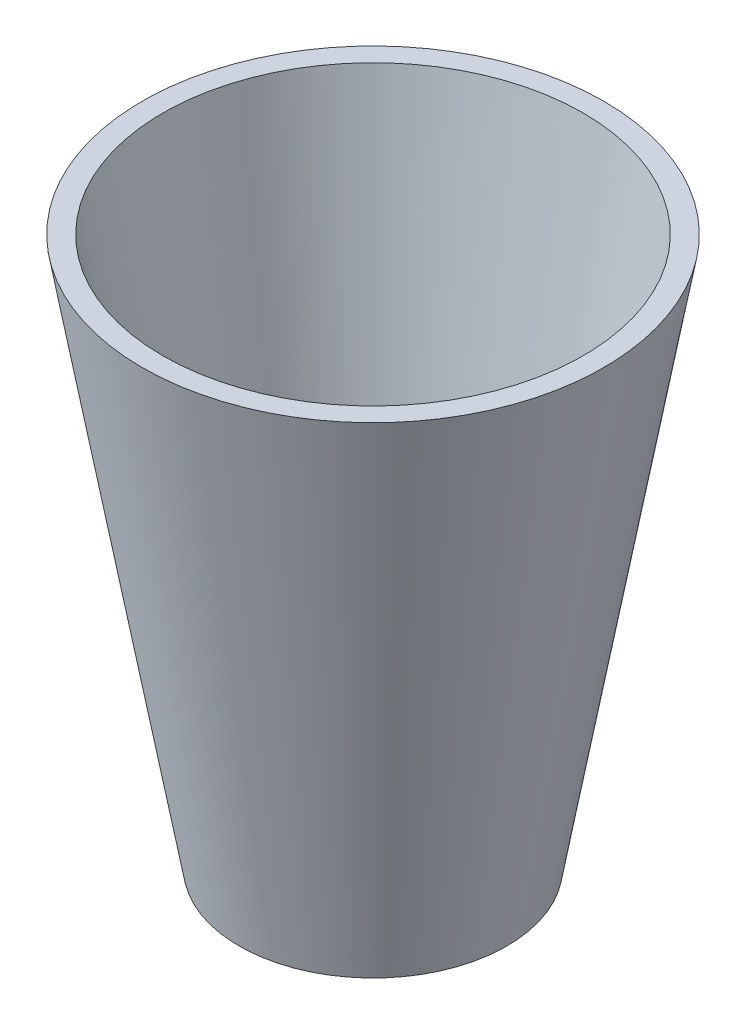
ISO-10303-21;
HEADER;
FILE_DESCRIPTION(('STEP AP214'),'2;1');
FILE_NAME('part.step','',(''),(''),'','','');
FILE_SCHEMA(('AUTOMOTIVE_DESIGN { 1 0 10303 214 1 1 1 1 }'));
ENDSEC;
DATA;
#1=APPLICATION_CONTEXT('core data for automotive mechanical design processes');
#2=APPLICATION_PROTOCOL_DEFINITION('international standard','automotive_design',2000,#1);
#3=PRODUCT_CONTEXT('',#1,'mechanical');
#4=PRODUCT('Part','Part','',(#3));
#5=PRODUCT_RELATED_PRODUCT_CATEGORY('part','',(#4));
#6=PRODUCT_DEFINITION_FORMATION('','',#4);
#7=PRODUCT_DEFINITION_CONTEXT('part definition',#1,'design');
#8=PRODUCT_DEFINITION('design','',#6,#7);
#9=PRODUCT_DEFINITION_SHAPE('','',#8);
#10=(LENGTH_UNIT() NAMED_UNIT(*) SI_UNIT(.MILLI.,.METRE.));
#11=(NAMED_UNIT(*) PLANE_ANGLE_UNIT() SI_UNIT($,.RADIAN.));
#12=(NAMED_UNIT(*) SI_UNIT($,.STERADIAN.) SOLID_ANGLE_UNIT());
#13=UNCERTAINTY_MEASURE_WITH_UNIT(LENGTH_MEASURE(1.E-05),#10,'distance_accuracy_value','');
#14=(GEOMETRIC_REPRESENTATION_CONTEXT(3) GLOBAL_UNCERTAINTY_ASSIGNED_CONTEXT((#13)) GLOBAL_UNIT_ASSIGNED_CONTEXT((#10,
#11,#12)) REPRESENTATION_CONTEXT('',''));
#15=CARTESIAN_POINT('',(0.,0.,0.));
#16=DIRECTION('',(0.,0.,1.));
#17=DIRECTION('',(1.,0.,0.));
#18=AXIS2_PLACEMENT_3D('',#15,#16,#17);
#19=CARTESIAN_POINT('',(0.,0.,0.));
#20=DIRECTION('',(0.,-1.,0.));
#21=DIRECTION('',(0.,0.,-1.));
#22=AXIS2_PLACEMENT_3D('',#19,#20,#21);
#23=PLANE('',#22);
#24=CARTESIAN_POINT('',(0.,0.,0.));
#25=DIRECTION('',(0.,-1.,0.));
#26=DIRECTION('',(0.,0.,-1.));
#27=AXIS2_PLACEMENT_3D('',#24,#25,#26);
#28=CIRCLE('',#27,22.875);
#29=CARTESIAN_POINT('',(0.,0.,-22.875));
#30=VERTEX_POINT('',#29);
#31=EDGE_CURVE('E10',#30,#30,#28,.T.);
#32=ORIENTED_EDGE('',*,*,#31,.T.);
#33=EDGE_LOOP('',(#32));
#34=FACE_BOUND('',#33,.T.);
#35=ADVANCED_FACE('F35',(#34),#23,.T.);
#36=CARTESIAN_POINT('',(0.,0.,0.));
#37=DIRECTION('',(0.,1.,0.));
#38=DIRECTION('',(0.,0.,1.));
#39=AXIS2_PLACEMENT_3D('',#36,#37,#38);
#40=CONICAL_SURFACE('',#39,22.875,0.174383300328485);
#41=CARTESIAN_POINT('',(0.,93.8,0.));
#42=DIRECTION('',(0.,-1.,0.));
#43=DIRECTION('',(0.,0.,-1.));
#44=AXIS2_PLACEMENT_3D('',#41,#42,#43);
#45=CIRCLE('',#44,39.4);
#46=CARTESIAN_POINT('',(0.,93.8,-39.4));
#47=VERTEX_POINT('',#46);
#48=EDGE_CURVE('E41',#47,#47,#45,.T.);
#49=ORIENTED_EDGE('',*,*,#48,.T.);
#50=EDGE_LOOP('',(#49));
#51=FACE_BOUND('',#50,.T.);
#52=ORIENTED_EDGE('',*,*,#31,.F.);
#53=EDGE_LOOP('',(#52));
#54=FACE_BOUND('',#53,.T.);
#55=ADVANCED_FACE('F67',(#51,#54),#40,.T.);
#56=CARTESIAN_POINT('',(0.,93.8,-39.4));
#57=DIRECTION('',(0.,1.,0.));
#58=DIRECTION('',(0.,0.,1.));
#59=AXIS2_PLACEMENT_3D('',#56,#57,#58);
#60=PLANE('',#59);
#61=CARTESIAN_POINT('',(0.,93.8,0.));
#62=DIRECTION('',(0.,-1.,0.));
#63=DIRECTION('',(0.,0.,-1.));
#64=AXIS2_PLACEMENT_3D('',#61,#62,#63);
#65=CIRCLE('',#64,35.8968705724999);
#66=CARTESIAN_POINT('',(0.,93.8,-35.8968705724999));
#67=VERTEX_POINT('',#66);
#68=EDGE_CURVE('E45',#67,#67,#65,.T.);
#69=ORIENTED_EDGE('',*,*,#68,.T.);
#70=EDGE_LOOP('',(#69));
#71=FACE_BOUND('',#70,.T.);
#72=ORIENTED_EDGE('',*,*,#48,.F.);
#73=EDGE_LOOP('',(#72));
#74=FACE_BOUND('',#73,.T.);
#75=ADVANCED_FACE('F64',(#71,#74),#60,.T.);
#76=CARTESIAN_POINT('',(0.,93.8,0.));
#77=DIRECTION('',(0.,1.,0.));
#78=DIRECTION('',(0.,0.,1.));
#79=AXIS2_PLACEMENT_3D('',#76,#77,#78);
#80=CONICAL_SURFACE('',#79,35.8968705724999,0.174383300328485);
#81=CARTESIAN_POINT('',(0.,3.45,0.));
#82=DIRECTION('',(0.,-1.,0.));
#83=DIRECTION('',(0.,0.,-1.));
#84=AXIS2_PLACEMENT_3D('',#81,#82,#83);
#85=CIRCLE('',#84,19.9796664147174);
#86=CARTESIAN_POINT('',(0.,3.45,-19.9796664147174));
#87=VERTEX_POINT('',#86);
#88=EDGE_CURVE('E49',#87,#87,#85,.T.);
#89=ORIENTED_EDGE('',*,*,#88,.T.);
#90=EDGE_LOOP('',(#89));
#91=FACE_BOUND('',#90,.T.);
#92=ORIENTED_EDGE('',*,*,#68,.F.);
#93=EDGE_LOOP('',(#92));
#94=FACE_BOUND('',#93,.T.);
#95=ADVANCED_FACE('F55',(#91,#94),#80,.F.);
#96=CARTESIAN_POINT('',(0.,3.45,0.));
#97=DIRECTION('',(0.,1.,0.));
#98=DIRECTION('',(0.,0.,1.));
#99=AXIS2_PLACEMENT_3D('',#96,#97,#98);
#100=PLANE('',#99);
#101=ORIENTED_EDGE('',*,*,#88,.F.);
#102=EDGE_LOOP('',(#101));
#103=FACE_BOUND('',#102,.T.);
#104=ADVANCED_FACE('F58',(#103),#100,.T.);
#105=CLOSED_SHELL('',(#35,#55,#75,#95,#104));
#106=MANIFOLD_SOLID_BREP('B2',#105);
#107=ADVANCED_BREP_SHAPE_REPRESENTATION('',(#18,#106),#14);
#108=SHAPE_DEFINITION_REPRESENTATION(#9,#107);
ENDSEC;
END-ISO-10303-21;
